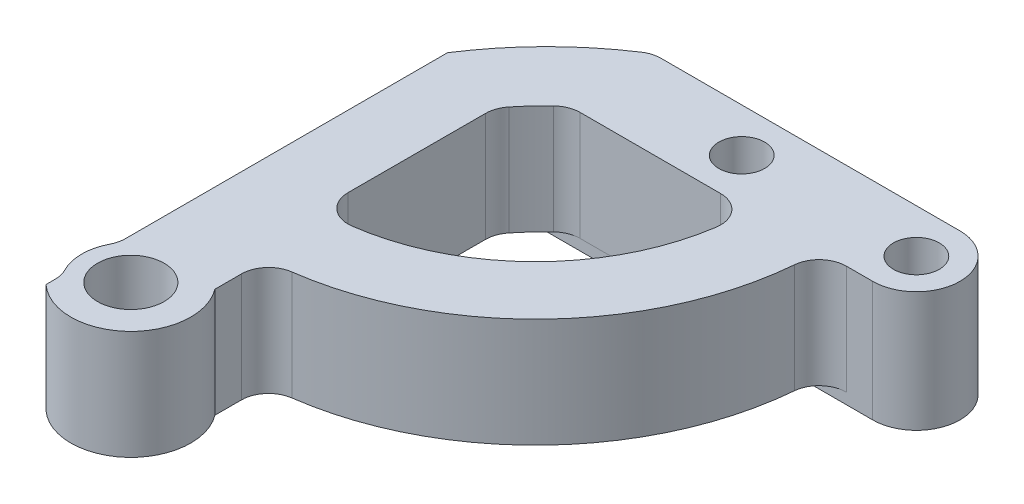
ISO-10303-21;
HEADER;
FILE_DESCRIPTION(('STEP AP214'),'2;1');
FILE_NAME('part.step','',(''),(''),'','','');
FILE_SCHEMA(('AUTOMOTIVE_DESIGN { 1 0 10303 214 1 1 1 1 }'));
ENDSEC;
DATA;
#1=APPLICATION_CONTEXT('core data for automotive mechanical design processes');
#2=APPLICATION_PROTOCOL_DEFINITION('international standard','automotive_design',2000,#1);
#3=PRODUCT_CONTEXT('',#1,'mechanical');
#4=PRODUCT('Part','Part','',(#3));
#5=PRODUCT_RELATED_PRODUCT_CATEGORY('part','',(#4));
#6=PRODUCT_DEFINITION_FORMATION('','',#4);
#7=PRODUCT_DEFINITION_CONTEXT('part definition',#1,'design');
#8=PRODUCT_DEFINITION('design','',#6,#7);
#9=PRODUCT_DEFINITION_SHAPE('','',#8);
#10=(LENGTH_UNIT() NAMED_UNIT(*) SI_UNIT(.MILLI.,.METRE.));
#11=(NAMED_UNIT(*) PLANE_ANGLE_UNIT() SI_UNIT($,.RADIAN.));
#12=(NAMED_UNIT(*) SI_UNIT($,.STERADIAN.) SOLID_ANGLE_UNIT());
#13=UNCERTAINTY_MEASURE_WITH_UNIT(LENGTH_MEASURE(1.E-05),#10,'distance_accuracy_value','');
#14=(GEOMETRIC_REPRESENTATION_CONTEXT(3) GLOBAL_UNCERTAINTY_ASSIGNED_CONTEXT((#13)) GLOBAL_UNIT_ASSIGNED_CONTEXT((#10,
#11,#12)) REPRESENTATION_CONTEXT('',''));
#15=CARTESIAN_POINT('',(0.,0.,0.));
#16=DIRECTION('',(0.,0.,1.));
#17=DIRECTION('',(1.,0.,0.));
#18=AXIS2_PLACEMENT_3D('',#15,#16,#17);
#19=CARTESIAN_POINT('',(-137.900064406004,11.,45.0701479564905));
#20=DIRECTION('',(0.,-1.,0.));
#21=DIRECTION('',(0.,0.,-1.));
#22=AXIS2_PLACEMENT_3D('',#19,#20,#21);
#23=CYLINDRICAL_SURFACE('',#22,5.50000000000002);
#24=CARTESIAN_POINT('',(-137.900064406004,1.,45.0701479564905));
#25=DIRECTION('',(0.,-1.,0.));
#26=DIRECTION('',(0.,0.,-1.));
#27=AXIS2_PLACEMENT_3D('',#24,#25,#26);
#28=CIRCLE('',#27,5.50000000000002);
#29=CARTESIAN_POINT('',(-133.507163129043,1.,41.7607041405488));
#30=VERTEX_POINT('',#29);
#31=CARTESIAN_POINT('',(-141.618040471587,1.,49.1231288318161));
#32=VERTEX_POINT('',#31);
#33=EDGE_CURVE('E330',#30,#32,#28,.T.);
#34=ORIENTED_EDGE('',*,*,#33,.F.);
#35=DIRECTION('',(0.,-1.,0.));
#36=VECTOR('',#35,1.);
#37=CARTESIAN_POINT('',(-133.507163129043,11.,41.7607041405488));
#38=LINE('',#37,#36);
#39=CARTESIAN_POINT('',(-133.507163129043,11.,41.7607041405488));
#40=VERTEX_POINT('',#39);
#41=EDGE_CURVE('E244',#40,#30,#38,.T.);
#42=ORIENTED_EDGE('',*,*,#41,.F.);
#43=CARTESIAN_POINT('',(-137.900064406004,11.,45.0701479564905));
#44=DIRECTION('',(0.,1.,0.));
#45=DIRECTION('',(0.,0.,1.));
#46=AXIS2_PLACEMENT_3D('',#43,#44,#45);
#47=CIRCLE('',#46,5.50000000000002);
#48=CARTESIAN_POINT('',(-141.618040471587,11.,49.1231288318161));
#49=VERTEX_POINT('',#48);
#50=EDGE_CURVE('E222',#49,#40,#47,.T.);
#51=ORIENTED_EDGE('',*,*,#50,.F.);
#52=DIRECTION('',(0.,-1.,0.));
#53=VECTOR('',#52,1.);
#54=CARTESIAN_POINT('',(-141.618040471587,11.,49.1231288318161));
#55=LINE('',#54,#53);
#56=EDGE_CURVE('E232',#49,#32,#55,.T.);
#57=ORIENTED_EDGE('',*,*,#56,.T.);
#58=EDGE_LOOP('',(#34,#42,#51,#57));
#59=FACE_BOUND('',#58,.T.);
#60=ADVANCED_FACE('F33',(#59),#23,.T.);
#61=CARTESIAN_POINT('',(-133.507163129043,11.,41.7607041405488));
#62=DIRECTION('',(-1.,0.,0.));
#63=DIRECTION('',(0.,0.,1.));
#64=AXIS2_PLACEMENT_3D('',#61,#62,#63);
#65=PLANE('',#64);
#66=DIRECTION('',(0.,0.,1.));
#67=VECTOR('',#66,1.);
#68=CARTESIAN_POINT('',(-133.507163129043,1.,41.7607041405488));
#69=LINE('',#68,#67);
#70=CARTESIAN_POINT('',(-133.507163129043,1.,39.3378444562118));
#71=VERTEX_POINT('',#70);
#72=EDGE_CURVE('E342',#71,#30,#69,.T.);
#73=ORIENTED_EDGE('',*,*,#72,.F.);
#74=DIRECTION('',(0.,1.,0.));
#75=VECTOR('',#74,1.);
#76=CARTESIAN_POINT('',(-133.507163129043,11.,39.3378444562118));
#77=LINE('',#76,#75);
#78=CARTESIAN_POINT('',(-133.507163129043,11.,39.3378444562118));
#79=VERTEX_POINT('',#78);
#80=EDGE_CURVE('E281',#71,#79,#77,.T.);
#81=ORIENTED_EDGE('',*,*,#80,.T.);
#82=DIRECTION('',(0.,0.,-1.));
#83=VECTOR('',#82,1.);
#84=CARTESIAN_POINT('',(-133.507163129043,11.,41.7607041405488));
#85=LINE('',#84,#83);
#86=EDGE_CURVE('E226',#40,#79,#85,.T.);
#87=ORIENTED_EDGE('',*,*,#86,.F.);
#88=ORIENTED_EDGE('',*,*,#41,.T.);
#89=EDGE_LOOP('',(#73,#81,#87,#88));
#90=FACE_BOUND('',#89,.T.);
#91=ADVANCED_FACE('F442',(#90),#65,.F.);
#92=CARTESIAN_POINT('',(-134.905127412307,11.,11.0000000667594));
#93=DIRECTION('',(0.,-1.,0.));
#94=DIRECTION('',(0.,0.,-1.));
#95=AXIS2_PLACEMENT_3D('',#92,#93,#94);
#96=CYLINDRICAL_SURFACE('',#95,26.1046770685219);
#97=CARTESIAN_POINT('',(-134.905127412307,1.,11.0000000667594));
#98=DIRECTION('',(0.,-1.,0.));
#99=DIRECTION('',(0.,0.,-1.));
#100=AXIS2_PLACEMENT_3D('',#97,#98,#99);
#101=CIRCLE('',#100,26.1046770685219);
#102=CARTESIAN_POINT('',(-108.900340232312,1.,13.2814926867282));
#103=VERTEX_POINT('',#102);
#104=CARTESIAN_POINT('',(-131.347838560715,1.,36.8611651773679));
#105=VERTEX_POINT('',#104);
#106=EDGE_CURVE('E346',#103,#105,#101,.T.);
#107=ORIENTED_EDGE('',*,*,#106,.F.);
#108=DIRECTION('',(0.,-1.,0.));
#109=VECTOR('',#108,1.);
#110=CARTESIAN_POINT('',(-108.900340232311,11.,13.2814926867282));
#111=LINE('',#110,#109);
#112=CARTESIAN_POINT('',(-108.900340232311,11.,13.2814926867282));
#113=VERTEX_POINT('',#112);
#114=EDGE_CURVE('E259',#103,#113,#111,.F.);
#115=ORIENTED_EDGE('',*,*,#114,.T.);
#116=CARTESIAN_POINT('',(-134.905127412307,11.,11.0000000667594));
#117=DIRECTION('',(0.,1.,0.));
#118=DIRECTION('',(0.,0.,1.));
#119=AXIS2_PLACEMENT_3D('',#116,#117,#118);
#120=CIRCLE('',#119,26.1046770685219);
#121=CARTESIAN_POINT('',(-131.347838560715,11.,36.8611651773679));
#122=VERTEX_POINT('',#121);
#123=EDGE_CURVE('E397',#122,#113,#120,.T.);
#124=ORIENTED_EDGE('',*,*,#123,.F.);
#125=DIRECTION('',(0.,-1.,0.));
#126=VECTOR('',#125,1.);
#127=CARTESIAN_POINT('',(-131.347838560715,11.,36.8611651773679));
#128=LINE('',#127,#126);
#129=EDGE_CURVE('E256',#122,#105,#128,.T.);
#130=ORIENTED_EDGE('',*,*,#129,.T.);
#131=EDGE_LOOP('',(#107,#115,#124,#130));
#132=FACE_BOUND('',#131,.T.);
#133=ADVANCED_FACE('F432',(#132),#96,.T.);
#134=CARTESIAN_POINT('',(-141.618040471587,11.,42.5350633473));
#135=DIRECTION('',(1.,0.,0.));
#136=DIRECTION('',(0.,0.,-1.));
#137=AXIS2_PLACEMENT_3D('',#134,#135,#136);
#138=PLANE('',#137);
#139=DIRECTION('',(0.,0.,-1.));
#140=VECTOR('',#139,1.);
#141=CARTESIAN_POINT('',(-141.618040471587,1.,42.5350633473));
#142=LINE('',#141,#140);
#143=CARTESIAN_POINT('',(-141.618040471587,1.,41.8550626313644));
#144=VERTEX_POINT('',#143);
#145=CARTESIAN_POINT('',(-141.618040471587,1.,12.3375284892954));
#146=VERTEX_POINT('',#145);
#147=EDGE_CURVE('E338',#144,#146,#142,.T.);
#148=ORIENTED_EDGE('',*,*,#147,.F.);
#149=DIRECTION('',(0.,1.,0.));
#150=VECTOR('',#149,1.);
#151=CARTESIAN_POINT('',(-141.618040471587,11.,41.8550626313644));
#152=LINE('',#151,#150);
#153=CARTESIAN_POINT('',(-141.618040471587,11.,41.8550626313644));
#154=VERTEX_POINT('',#153);
#155=EDGE_CURVE('E288',#144,#154,#152,.T.);
#156=ORIENTED_EDGE('',*,*,#155,.T.);
#157=DIRECTION('',(0.,0.,1.));
#158=VECTOR('',#157,1.);
#159=CARTESIAN_POINT('',(-141.618040471587,11.,42.5350633473));
#160=LINE('',#159,#158);
#161=CARTESIAN_POINT('',(-141.618040471587,11.,12.3375284892954));
#162=VERTEX_POINT('',#161);
#163=EDGE_CURVE('E408',#162,#154,#160,.T.);
#164=ORIENTED_EDGE('',*,*,#163,.F.);
#165=DIRECTION('',(0.,-1.,0.));
#166=VECTOR('',#165,1.);
#167=CARTESIAN_POINT('',(-141.618040471587,11.,12.3375284892954));
#168=LINE('',#167,#166);
#169=EDGE_CURVE('E235',#162,#146,#168,.T.);
#170=ORIENTED_EDGE('',*,*,#169,.T.);
#171=EDGE_LOOP('',(#148,#156,#164,#170));
#172=FACE_BOUND('',#171,.T.);
#173=ADVANCED_FACE('F486',(#172),#138,.F.);
#174=CARTESIAN_POINT('',(-137.900064406004,11.,45.0701479564905));
#175=DIRECTION('',(0.,-1.,0.));
#176=DIRECTION('',(0.,0.,-1.));
#177=AXIS2_PLACEMENT_3D('',#174,#175,#176);
#178=CYLINDRICAL_SURFACE('',#177,4.49999999999999);
#179=CARTESIAN_POINT('',(-137.900064406004,1.,45.0701479564905));
#180=DIRECTION('',(0.,-1.,0.));
#181=DIRECTION('',(0.,0.,-1.));
#182=AXIS2_PLACEMENT_3D('',#179,#180,#181);
#183=CIRCLE('',#182,4.49999999999999);
#184=CARTESIAN_POINT('',(-141.897334733879,1.,47.136988522643));
#185=VERTEX_POINT('',#184);
#186=CARTESIAN_POINT('',(-141.897334733879,1.,43.003307390338));
#187=VERTEX_POINT('',#186);
#188=EDGE_CURVE('E325',#185,#187,#183,.T.);
#189=ORIENTED_EDGE('',*,*,#188,.F.);
#190=DIRECTION('',(0.,-1.,0.));
#191=VECTOR('',#190,1.);
#192=CARTESIAN_POINT('',(-141.897334733879,11.,47.136988522643));
#193=LINE('',#192,#191);
#194=CARTESIAN_POINT('',(-141.897334733879,11.,47.136988522643));
#195=VERTEX_POINT('',#194);
#196=EDGE_CURVE('E283',#185,#195,#193,.F.);
#197=ORIENTED_EDGE('',*,*,#196,.T.);
#198=CARTESIAN_POINT('',(-137.900064406004,11.,45.0701479564905));
#199=DIRECTION('',(0.,1.,0.));
#200=DIRECTION('',(0.,0.,1.));
#201=AXIS2_PLACEMENT_3D('',#198,#199,#200);
#202=CIRCLE('',#201,4.49999999999999);
#203=CARTESIAN_POINT('',(-141.897334733879,11.,43.003307390338));
#204=VERTEX_POINT('',#203);
#205=EDGE_CURVE('E315',#204,#195,#202,.T.);
#206=ORIENTED_EDGE('',*,*,#205,.F.);
#207=DIRECTION('',(0.,-1.,0.));
#208=VECTOR('',#207,1.);
#209=CARTESIAN_POINT('',(-141.897334733879,11.,43.003307390338));
#210=LINE('',#209,#208);
#211=EDGE_CURVE('E285',#204,#187,#210,.T.);
#212=ORIENTED_EDGE('',*,*,#211,.T.);
#213=EDGE_LOOP('',(#189,#197,#206,#212));
#214=FACE_BOUND('',#213,.T.);
#215=ADVANCED_FACE('F328',(#214),#178,.T.);
#216=CARTESIAN_POINT('',(-141.618040471587,11.,49.1231288318161));
#217=DIRECTION('',(1.,0.,0.));
#218=DIRECTION('',(0.,0.,-1.));
#219=AXIS2_PLACEMENT_3D('',#216,#217,#218);
#220=PLANE('',#219);
#221=DIRECTION('',(0.,0.,-1.));
#222=VECTOR('',#221,1.);
#223=CARTESIAN_POINT('',(-141.618040471587,1.,49.1231288318161));
#224=LINE('',#223,#222);
#225=CARTESIAN_POINT('',(-141.618040471587,1.,48.2852332816167));
#226=VERTEX_POINT('',#225);
#227=EDGE_CURVE('E55',#32,#226,#224,.T.);
#228=ORIENTED_EDGE('',*,*,#227,.F.);
#229=ORIENTED_EDGE('',*,*,#56,.F.);
#230=DIRECTION('',(0.,0.,1.));
#231=VECTOR('',#230,1.);
#232=CARTESIAN_POINT('',(-141.618040471587,11.,49.1231288318161));
#233=LINE('',#232,#231);
#234=CARTESIAN_POINT('',(-141.618040471587,11.,48.2852332816167));
#235=VERTEX_POINT('',#234);
#236=EDGE_CURVE('E236',#235,#49,#233,.T.);
#237=ORIENTED_EDGE('',*,*,#236,.F.);
#238=DIRECTION('',(0.,1.,0.));
#239=VECTOR('',#238,1.);
#240=CARTESIAN_POINT('',(-141.618040471587,0.,48.2852332816167));
#241=LINE('',#240,#239);
#242=EDGE_CURVE('E290',#235,#226,#241,.F.);
#243=ORIENTED_EDGE('',*,*,#242,.T.);
#244=EDGE_LOOP('',(#228,#229,#237,#243));
#245=FACE_BOUND('',#244,.T.);
#246=ADVANCED_FACE('F320',(#245),#220,.F.);
#247=CARTESIAN_POINT('',(-137.900064406004,11.,45.0701479564905));
#248=DIRECTION('',(0.,-1.,0.));
#249=DIRECTION('',(0.,0.,-1.));
#250=AXIS2_PLACEMENT_3D('',#247,#248,#249);
#251=CYLINDRICAL_SURFACE('',#250,3.04999999999999);
#252=CARTESIAN_POINT('',(-137.900064406004,11.,45.0701479564905));
#253=DIRECTION('',(0.,1.,0.));
#254=DIRECTION('',(0.,0.,1.));
#255=AXIS2_PLACEMENT_3D('',#252,#253,#254);
#256=CIRCLE('',#255,3.04999999999999);
#257=CARTESIAN_POINT('',(-137.900064406004,11.,48.1201479564905));
#258=VERTEX_POINT('',#257);
#259=EDGE_CURVE('E387',#258,#258,#256,.T.);
#260=ORIENTED_EDGE('',*,*,#259,.T.);
#261=EDGE_LOOP('',(#260));
#262=FACE_BOUND('',#261,.T.);
#263=CARTESIAN_POINT('',(-137.900064406004,1.,45.0701479564905));
#264=DIRECTION('',(0.,-1.,0.));
#265=DIRECTION('',(0.,0.,-1.));
#266=AXIS2_PLACEMENT_3D('',#263,#264,#265);
#267=CIRCLE('',#266,3.04999999999999);
#268=CARTESIAN_POINT('',(-137.900064406004,1.,42.0201479564905));
#269=VERTEX_POINT('',#268);
#270=EDGE_CURVE('E215',#269,#269,#267,.T.);
#271=ORIENTED_EDGE('',*,*,#270,.T.);
#272=EDGE_LOOP('',(#271));
#273=FACE_BOUND('',#272,.T.);
#274=ADVANCED_FACE('F518',(#262,#273),#251,.F.);
#275=CARTESIAN_POINT('',(-134.905127412307,11.,11.0000000667594));
#276=DIRECTION('',(0.,-1.,0.));
#277=DIRECTION('',(0.,0.,-1.));
#278=AXIS2_PLACEMENT_3D('',#275,#276,#277);
#279=CYLINDRICAL_SURFACE('',#278,19.6514066306311);
#280=DIRECTION('',(0.,-1.,0.));
#281=VECTOR('',#280,1.);
#282=CARTESIAN_POINT('',(-115.463600053519,11.,13.8644016656835));
#283=LINE('',#282,#281);
#284=CARTESIAN_POINT('',(-115.463600053519,11.,13.8644016656835));
#285=VERTEX_POINT('',#284);
#286=CARTESIAN_POINT('',(-115.463600053519,1.,13.8644016656835));
#287=VERTEX_POINT('',#286);
#288=EDGE_CURVE('E271',#285,#287,#283,.T.);
#289=ORIENTED_EDGE('',*,*,#288,.T.);
#290=CARTESIAN_POINT('',(-134.905127412307,1.,11.0000000667594));
#291=DIRECTION('',(0.,-1.,0.));
#292=DIRECTION('',(0.,0.,-1.));
#293=AXIS2_PLACEMENT_3D('',#290,#291,#292);
#294=CIRCLE('',#293,19.6514066306311);
#295=CARTESIAN_POINT('',(-132.23407891148,1.,30.4690340044935));
#296=VERTEX_POINT('',#295);
#297=EDGE_CURVE('E363',#287,#296,#294,.T.);
#298=ORIENTED_EDGE('',*,*,#297,.T.);
#299=DIRECTION('',(0.,-1.,0.));
#300=VECTOR('',#299,1.);
#301=CARTESIAN_POINT('',(-132.23407891148,11.,30.4690340044935));
#302=LINE('',#301,#300);
#303=CARTESIAN_POINT('',(-132.23407891148,11.,30.4690340044935));
#304=VERTEX_POINT('',#303);
#305=EDGE_CURVE('E274',#296,#304,#302,.F.);
#306=ORIENTED_EDGE('',*,*,#305,.T.);
#307=CARTESIAN_POINT('',(-134.905127412307,11.,11.0000000667594));
#308=DIRECTION('',(0.,1.,0.));
#309=DIRECTION('',(0.,0.,1.));
#310=AXIS2_PLACEMENT_3D('',#307,#308,#309);
#311=CIRCLE('',#310,19.6514066306311);
#312=EDGE_CURVE('E373',#304,#285,#311,.T.);
#313=ORIENTED_EDGE('',*,*,#312,.T.);
#314=EDGE_LOOP('',(#289,#298,#306,#313));
#315=FACE_BOUND('',#314,.T.);
#316=ADVANCED_FACE('F522',(#315),#279,.F.);
#317=CARTESIAN_POINT('',(-115.253720781676,11.,11.0000000667594));
#318=DIRECTION('',(0.,0.,1.));
#319=DIRECTION('',(1.,0.,0.));
#320=AXIS2_PLACEMENT_3D('',#317,#318,#319);
#321=PLANE('',#320);
#322=DIRECTION('',(0.,1.,0.));
#323=VECTOR('',#322,1.);
#324=CARTESIAN_POINT('',(-130.807896641582,0.,11.0000000667594));
#325=LINE('',#324,#323);
#326=CARTESIAN_POINT('',(-130.807896641582,11.,11.0000000667594));
#327=VERTEX_POINT('',#326);
#328=CARTESIAN_POINT('',(-130.807896641582,1.,11.0000000667594));
#329=VERTEX_POINT('',#328);
#330=EDGE_CURVE('E276',#327,#329,#325,.F.);
#331=ORIENTED_EDGE('',*,*,#330,.T.);
#332=DIRECTION('',(1.,0.,0.));
#333=VECTOR('',#332,1.);
#334=CARTESIAN_POINT('',(-115.253720781676,1.,11.0000000667594));
#335=LINE('',#334,#333);
#336=CARTESIAN_POINT('',(-117.936899767403,1.,11.0000000667594));
#337=VERTEX_POINT('',#336);
#338=EDGE_CURVE('E48',#329,#337,#335,.T.);
#339=ORIENTED_EDGE('',*,*,#338,.T.);
#340=DIRECTION('',(0.,1.,0.));
#341=VECTOR('',#340,1.);
#342=CARTESIAN_POINT('',(-117.936899767403,11.,11.0000000667594));
#343=LINE('',#342,#341);
#344=CARTESIAN_POINT('',(-117.936899767403,11.,11.0000000667594));
#345=VERTEX_POINT('',#344);
#346=EDGE_CURVE('E279',#337,#345,#343,.T.);
#347=ORIENTED_EDGE('',*,*,#346,.T.);
#348=DIRECTION('',(-1.,0.,0.));
#349=VECTOR('',#348,1.);
#350=CARTESIAN_POINT('',(-115.253720781676,11.,11.0000000667594));
#351=LINE('',#350,#349);
#352=EDGE_CURVE('E378',#345,#327,#351,.T.);
#353=ORIENTED_EDGE('',*,*,#352,.T.);
#354=EDGE_LOOP('',(#331,#339,#347,#353));
#355=FACE_BOUND('',#354,.T.);
#356=ADVANCED_FACE('F528',(#355),#321,.T.);
#357=CARTESIAN_POINT('',(-115.936153865527,11.,28.934107444418));
#358=DIRECTION('',(0.,-1.,0.));
#359=DIRECTION('',(0.,0.,-1.));
#360=AXIS2_PLACEMENT_3D('',#357,#358,#359);
#361=CYLINDRICAL_SURFACE('',#360,23.9331613100406);
#362=DIRECTION('',(0.,-1.,0.));
#363=VECTOR('',#362,1.);
#364=CARTESIAN_POINT('',(-134.499387278877,11.,13.8277321169641));
#365=LINE('',#364,#363);
#366=CARTESIAN_POINT('',(-134.499387278877,11.,13.8277321169641));
#367=VERTEX_POINT('',#366);
#368=CARTESIAN_POINT('',(-134.499387278877,1.,13.8277321169641));
#369=VERTEX_POINT('',#368);
#370=EDGE_CURVE('E263',#367,#369,#365,.T.);
#371=ORIENTED_EDGE('',*,*,#370,.T.);
#372=CARTESIAN_POINT('',(-115.936153865527,1.,28.934107444418));
#373=DIRECTION('',(0.,-1.,0.));
#374=DIRECTION('',(0.,0.,-1.));
#375=AXIS2_PLACEMENT_3D('',#372,#373,#374);
#376=CIRCLE('',#375,23.9331613100406);
#377=CARTESIAN_POINT('',(-132.542561743118,1.,11.6997398118211));
#378=VERTEX_POINT('',#377);
#379=EDGE_CURVE('E352',#369,#378,#376,.T.);
#380=ORIENTED_EDGE('',*,*,#379,.T.);
#381=DIRECTION('',(0.,-1.,0.));
#382=VECTOR('',#381,1.);
#383=CARTESIAN_POINT('',(-132.542561743118,11.,11.6997398118211));
#384=LINE('',#383,#382);
#385=CARTESIAN_POINT('',(-132.542561743118,11.,11.6997398118211));
#386=VERTEX_POINT('',#385);
#387=EDGE_CURVE('E261',#378,#386,#384,.F.);
#388=ORIENTED_EDGE('',*,*,#387,.T.);
#389=CARTESIAN_POINT('',(-115.936153865527,11.,28.934107444418));
#390=DIRECTION('',(0.,1.,0.));
#391=DIRECTION('',(0.,0.,1.));
#392=AXIS2_PLACEMENT_3D('',#389,#390,#391);
#393=CIRCLE('',#392,23.9331613100406);
#394=EDGE_CURVE('E381',#386,#367,#393,.T.);
#395=ORIENTED_EDGE('',*,*,#394,.T.);
#396=EDGE_LOOP('',(#371,#380,#388,#395));
#397=FACE_BOUND('',#396,.T.);
#398=ADVANCED_FACE('F553',(#397),#361,.F.);
#399=CARTESIAN_POINT('',(-135.059388775707,11.,14.5432041766409));
#400=DIRECTION('',(0.999999419177983,0.,0.00107779575862326));
#401=DIRECTION('',(0.00107779575862326,0.,-0.999999419177983));
#402=AXIS2_PLACEMENT_3D('',#399,#400,#401);
#403=PLANE('',#402);
#404=DIRECTION('',(0.,1.,0.));
#405=VECTOR('',#404,1.);
#406=CARTESIAN_POINT('',(-135.073881188368,0.,27.9895404869568));
#407=LINE('',#406,#405);
#408=CARTESIAN_POINT('',(-135.073881188368,11.,27.9895404869568));
#409=VERTEX_POINT('',#408);
#410=CARTESIAN_POINT('',(-135.073881188368,1.,27.9895404869568));
#411=VERTEX_POINT('',#410);
#412=EDGE_CURVE('E266',#409,#411,#407,.F.);
#413=ORIENTED_EDGE('',*,*,#412,.T.);
#414=DIRECTION('',(0.00107779575862326,0.,-0.999999419177983));
#415=VECTOR('',#414,1.);
#416=CARTESIAN_POINT('',(-135.059388775707,1.,14.5432041766409));
#417=LINE('',#416,#415);
#418=CARTESIAN_POINT('',(-135.060315474511,1.,15.4030129660278));
#419=VERTEX_POINT('',#418);
#420=EDGE_CURVE('E360',#411,#419,#417,.T.);
#421=ORIENTED_EDGE('',*,*,#420,.T.);
#422=DIRECTION('',(0.,1.,0.));
#423=VECTOR('',#422,1.);
#424=CARTESIAN_POINT('',(-135.060315474511,11.,15.4030129660278));
#425=LINE('',#424,#423);
#426=CARTESIAN_POINT('',(-135.060315474511,11.,15.4030129660278));
#427=VERTEX_POINT('',#426);
#428=EDGE_CURVE('E269',#419,#427,#425,.T.);
#429=ORIENTED_EDGE('',*,*,#428,.T.);
#430=DIRECTION('',(-0.00107779575862326,0.,0.999999419177983));
#431=VECTOR('',#430,1.);
#432=CARTESIAN_POINT('',(-135.059388775707,11.,14.5432041766409));
#433=LINE('',#432,#431);
#434=EDGE_CURVE('E384',#427,#409,#433,.T.);
#435=ORIENTED_EDGE('',*,*,#434,.T.);
#436=EDGE_LOOP('',(#413,#421,#429,#435));
#437=FACE_BOUND('',#436,.T.);
#438=ADVANCED_FACE('F459',(#437),#403,.T.);
#439=CARTESIAN_POINT('',(-106.409906515038,11.,13.499987308782));
#440=DIRECTION('',(0.,-1.,0.));
#441=DIRECTION('',(0.,0.,-1.));
#442=AXIS2_PLACEMENT_3D('',#439,#440,#441);
#443=CYLINDRICAL_SURFACE('',#442,2.5);
#444=CARTESIAN_POINT('',(-106.409906515038,1.,13.499987308782));
#445=DIRECTION('',(0.,-1.,0.));
#446=DIRECTION('',(0.,0.,-1.));
#447=AXIS2_PLACEMENT_3D('',#444,#445,#446);
#448=CIRCLE('',#447,2.5);
#449=CARTESIAN_POINT('',(-106.409906515038,1.,10.999987308782));
#450=VERTEX_POINT('',#449);
#451=EDGE_CURVE('E348',#450,#103,#448,.F.);
#452=ORIENTED_EDGE('',*,*,#451,.F.);
#453=DIRECTION('',(0.,1.,0.));
#454=VECTOR('',#453,1.);
#455=CARTESIAN_POINT('',(-106.409906515038,0.,10.999987308782));
#456=LINE('',#455,#454);
#457=CARTESIAN_POINT('',(-106.409906515038,11.,10.999987308782));
#458=VERTEX_POINT('',#457);
#459=EDGE_CURVE('E254',#458,#450,#456,.F.);
#460=ORIENTED_EDGE('',*,*,#459,.F.);
#461=CARTESIAN_POINT('',(-106.409906515038,11.,13.499987308782));
#462=DIRECTION('',(0.,1.,0.));
#463=DIRECTION('',(0.,0.,1.));
#464=AXIS2_PLACEMENT_3D('',#461,#462,#463);
#465=CIRCLE('',#464,2.5);
#466=EDGE_CURVE('E293',#113,#458,#465,.F.);
#467=ORIENTED_EDGE('',*,*,#466,.F.);
#468=ORIENTED_EDGE('',*,*,#114,.F.);
#469=EDGE_LOOP('',(#452,#460,#467,#468));
#470=FACE_BOUND('',#469,.T.);
#471=ADVANCED_FACE('F427',(#470),#443,.F.);
#472=CARTESIAN_POINT('',(-132.560316926566,11.,15.4057074554244));
#473=DIRECTION('',(0.,-1.,0.));
#474=DIRECTION('',(0.,0.,-1.));
#475=AXIS2_PLACEMENT_3D('',#472,#473,#474);
#476=CYLINDRICAL_SURFACE('',#475,2.5);
#477=CARTESIAN_POINT('',(-132.560316926566,1.,15.4057074554244));
#478=DIRECTION('',(0.,-1.,0.));
#479=DIRECTION('',(0.,0.,-1.));
#480=AXIS2_PLACEMENT_3D('',#477,#478,#479);
#481=CIRCLE('',#480,2.5);
#482=EDGE_CURVE('E358',#369,#419,#481,.F.);
#483=ORIENTED_EDGE('',*,*,#482,.F.);
#484=ORIENTED_EDGE('',*,*,#370,.F.);
#485=CARTESIAN_POINT('',(-132.560316926566,11.,15.4057074554244));
#486=DIRECTION('',(0.,1.,0.));
#487=DIRECTION('',(0.,0.,1.));
#488=AXIS2_PLACEMENT_3D('',#485,#486,#487);
#489=CIRCLE('',#488,2.5);
#490=EDGE_CURVE('E295',#427,#367,#489,.F.);
#491=ORIENTED_EDGE('',*,*,#490,.F.);
#492=ORIENTED_EDGE('',*,*,#428,.F.);
#493=EDGE_LOOP('',(#483,#484,#491,#492));
#494=FACE_BOUND('',#493,.T.);
#495=ADVANCED_FACE('F458',(#494),#476,.F.);
#496=CARTESIAN_POINT('',(-132.573882640423,11.,27.9922349763533));
#497=DIRECTION('',(0.,-1.,0.));
#498=DIRECTION('',(0.,0.,-1.));
#499=AXIS2_PLACEMENT_3D('',#496,#497,#498);
#500=CYLINDRICAL_SURFACE('',#499,2.5);
#501=CARTESIAN_POINT('',(-132.573882640423,1.,27.9922349763533));
#502=DIRECTION('',(0.,-1.,0.));
#503=DIRECTION('',(0.,0.,-1.));
#504=AXIS2_PLACEMENT_3D('',#501,#502,#503);
#505=CIRCLE('',#504,2.5);
#506=EDGE_CURVE('E366',#411,#296,#505,.F.);
#507=ORIENTED_EDGE('',*,*,#506,.F.);
#508=ORIENTED_EDGE('',*,*,#412,.F.);
#509=CARTESIAN_POINT('',(-132.573882640423,11.,27.9922349763533));
#510=DIRECTION('',(0.,1.,0.));
#511=DIRECTION('',(0.,0.,1.));
#512=AXIS2_PLACEMENT_3D('',#509,#510,#511);
#513=CIRCLE('',#512,2.5);
#514=EDGE_CURVE('E297',#304,#409,#513,.F.);
#515=ORIENTED_EDGE('',*,*,#514,.F.);
#516=ORIENTED_EDGE('',*,*,#305,.F.);
#517=EDGE_LOOP('',(#507,#508,#515,#516));
#518=FACE_BOUND('',#517,.T.);
#519=ADVANCED_FACE('F462',(#518),#500,.F.);
#520=CARTESIAN_POINT('',(-117.936899767403,11.,13.5000000667594));
#521=DIRECTION('',(0.,-1.,0.));
#522=DIRECTION('',(0.,0.,-1.));
#523=AXIS2_PLACEMENT_3D('',#520,#521,#522);
#524=CYLINDRICAL_SURFACE('',#523,2.5);
#525=CARTESIAN_POINT('',(-117.936899767403,1.,13.5000000667594));
#526=DIRECTION('',(0.,-1.,0.));
#527=DIRECTION('',(0.,0.,-1.));
#528=AXIS2_PLACEMENT_3D('',#525,#526,#527);
#529=CIRCLE('',#528,2.5);
#530=EDGE_CURVE('E356',#287,#337,#529,.F.);
#531=ORIENTED_EDGE('',*,*,#530,.F.);
#532=ORIENTED_EDGE('',*,*,#288,.F.);
#533=CARTESIAN_POINT('',(-117.936899767403,11.,13.5000000667594));
#534=DIRECTION('',(0.,1.,0.));
#535=DIRECTION('',(0.,0.,1.));
#536=AXIS2_PLACEMENT_3D('',#533,#534,#535);
#537=CIRCLE('',#536,2.5);
#538=EDGE_CURVE('E299',#345,#285,#537,.F.);
#539=ORIENTED_EDGE('',*,*,#538,.F.);
#540=ORIENTED_EDGE('',*,*,#346,.F.);
#541=EDGE_LOOP('',(#531,#532,#539,#540));
#542=FACE_BOUND('',#541,.T.);
#543=ADVANCED_FACE('F466',(#542),#524,.F.);
#544=CARTESIAN_POINT('',(-130.807896641582,11.,13.5000000667594));
#545=DIRECTION('',(0.,-1.,0.));
#546=DIRECTION('',(0.,0.,-1.));
#547=AXIS2_PLACEMENT_3D('',#544,#545,#546);
#548=CYLINDRICAL_SURFACE('',#547,2.5);
#549=CARTESIAN_POINT('',(-130.807896641582,1.,13.5000000667594));
#550=DIRECTION('',(0.,-1.,0.));
#551=DIRECTION('',(0.,0.,-1.));
#552=AXIS2_PLACEMENT_3D('',#549,#550,#551);
#553=CIRCLE('',#552,2.5);
#554=EDGE_CURVE('E350',#329,#378,#553,.F.);
#555=ORIENTED_EDGE('',*,*,#554,.F.);
#556=ORIENTED_EDGE('',*,*,#330,.F.);
#557=CARTESIAN_POINT('',(-130.807896641582,11.,13.5000000667594));
#558=DIRECTION('',(0.,1.,0.));
#559=DIRECTION('',(0.,0.,1.));
#560=AXIS2_PLACEMENT_3D('',#557,#558,#559);
#561=CIRCLE('',#560,2.5);
#562=EDGE_CURVE('E301',#386,#327,#561,.F.);
#563=ORIENTED_EDGE('',*,*,#562,.F.);
#564=ORIENTED_EDGE('',*,*,#387,.F.);
#565=EDGE_LOOP('',(#555,#556,#563,#564));
#566=FACE_BOUND('',#565,.T.);
#567=ADVANCED_FACE('F470',(#566),#548,.F.);
#568=CARTESIAN_POINT('',(-131.007163129043,11.,39.3378444562118));
#569=DIRECTION('',(0.,-1.,0.));
#570=DIRECTION('',(0.,0.,-1.));
#571=AXIS2_PLACEMENT_3D('',#568,#569,#570);
#572=CYLINDRICAL_SURFACE('',#571,2.5);
#573=CARTESIAN_POINT('',(-131.007163129043,1.,39.3378444562118));
#574=DIRECTION('',(0.,-1.,0.));
#575=DIRECTION('',(0.,0.,-1.));
#576=AXIS2_PLACEMENT_3D('',#573,#574,#575);
#577=CIRCLE('',#576,2.5);
#578=EDGE_CURVE('E344',#105,#71,#577,.F.);
#579=ORIENTED_EDGE('',*,*,#578,.F.);
#580=ORIENTED_EDGE('',*,*,#129,.F.);
#581=CARTESIAN_POINT('',(-131.007163129043,11.,39.3378444562118));
#582=DIRECTION('',(0.,1.,0.));
#583=DIRECTION('',(0.,0.,1.));
#584=AXIS2_PLACEMENT_3D('',#581,#582,#583);
#585=CIRCLE('',#584,2.5);
#586=EDGE_CURVE('E303',#79,#122,#585,.F.);
#587=ORIENTED_EDGE('',*,*,#586,.F.);
#588=ORIENTED_EDGE('',*,*,#80,.F.);
#589=EDGE_LOOP('',(#579,#580,#587,#588));
#590=FACE_BOUND('',#589,.T.);
#591=ADVANCED_FACE('F437',(#590),#572,.F.);
#592=CARTESIAN_POINT('',(-144.118040471587,11.,41.8550626313644));
#593=DIRECTION('',(0.,-1.,0.));
#594=DIRECTION('',(0.,0.,-1.));
#595=AXIS2_PLACEMENT_3D('',#592,#593,#594);
#596=CYLINDRICAL_SURFACE('',#595,2.5);
#597=CARTESIAN_POINT('',(-144.118040471587,1.,41.8550626313644));
#598=DIRECTION('',(0.,-1.,0.));
#599=DIRECTION('',(0.,0.,-1.));
#600=AXIS2_PLACEMENT_3D('',#597,#598,#599);
#601=CIRCLE('',#600,2.5);
#602=EDGE_CURVE('E332',#187,#144,#601,.F.);
#603=ORIENTED_EDGE('',*,*,#602,.F.);
#604=ORIENTED_EDGE('',*,*,#211,.F.);
#605=CARTESIAN_POINT('',(-144.118040471587,11.,41.8550626313644));
#606=DIRECTION('',(0.,1.,0.));
#607=DIRECTION('',(0.,0.,1.));
#608=AXIS2_PLACEMENT_3D('',#605,#606,#607);
#609=CIRCLE('',#608,2.5);
#610=EDGE_CURVE('E305',#154,#204,#609,.F.);
#611=ORIENTED_EDGE('',*,*,#610,.F.);
#612=ORIENTED_EDGE('',*,*,#155,.F.);
#613=EDGE_LOOP('',(#603,#604,#611,#612));
#614=FACE_BOUND('',#613,.T.);
#615=ADVANCED_FACE('F476',(#614),#596,.F.);
#616=CARTESIAN_POINT('',(-144.118040471587,11.,48.2852332816167));
#617=DIRECTION('',(0.,-1.,0.));
#618=DIRECTION('',(0.,0.,-1.));
#619=AXIS2_PLACEMENT_3D('',#616,#617,#618);
#620=CYLINDRICAL_SURFACE('',#619,2.5);
#621=CARTESIAN_POINT('',(-144.118040471587,1.,48.2852332816167));
#622=DIRECTION('',(0.,-1.,0.));
#623=DIRECTION('',(0.,0.,-1.));
#624=AXIS2_PLACEMENT_3D('',#621,#622,#623);
#625=CIRCLE('',#624,2.5);
#626=EDGE_CURVE('E11',#226,#185,#625,.F.);
#627=ORIENTED_EDGE('',*,*,#626,.F.);
#628=ORIENTED_EDGE('',*,*,#242,.F.);
#629=CARTESIAN_POINT('',(-144.118040471587,11.,48.2852332816167));
#630=DIRECTION('',(0.,1.,0.));
#631=DIRECTION('',(0.,0.,1.));
#632=AXIS2_PLACEMENT_3D('',#629,#630,#631);
#633=CIRCLE('',#632,2.5);
#634=EDGE_CURVE('E41',#195,#235,#633,.F.);
#635=ORIENTED_EDGE('',*,*,#634,.F.);
#636=ORIENTED_EDGE('',*,*,#196,.F.);
#637=EDGE_LOOP('',(#627,#628,#635,#636));
#638=FACE_BOUND('',#637,.T.);
#639=ADVANCED_FACE('F35',(#638),#620,.F.);
#640=CARTESIAN_POINT('',(-137.900064406004,11.,45.0701479564905));
#641=DIRECTION('',(0.,1.,0.));
#642=DIRECTION('',(0.,0.,1.));
#643=AXIS2_PLACEMENT_3D('',#640,#641,#642);
#644=PLANE('',#643);
#645=ORIENTED_EDGE('',*,*,#352,.F.);
#646=ORIENTED_EDGE('',*,*,#538,.T.);
#647=ORIENTED_EDGE('',*,*,#312,.F.);
#648=ORIENTED_EDGE('',*,*,#514,.T.);
#649=ORIENTED_EDGE('',*,*,#434,.F.);
#650=ORIENTED_EDGE('',*,*,#490,.T.);
#651=ORIENTED_EDGE('',*,*,#394,.F.);
#652=ORIENTED_EDGE('',*,*,#562,.T.);
#653=EDGE_LOOP('',(#645,#646,#647,#648,#649,#650,#651,#652));
#654=FACE_BOUND('',#653,.T.);
#655=ORIENTED_EDGE('',*,*,#259,.F.);
#656=EDGE_LOOP('',(#655));
#657=FACE_BOUND('',#656,.T.);
#658=DIRECTION('',(-1.,0.,0.));
#659=VECTOR('',#658,1.);
#660=CARTESIAN_POINT('',(-104.000008179268,11.,2.99998730878197));
#661=LINE('',#660,#659);
#662=CARTESIAN_POINT('',(-104.000008179268,11.,2.99998730878197));
#663=VERTEX_POINT('',#662);
#664=CARTESIAN_POINT('',(-131.402518303239,11.,2.99998730878198));
#665=VERTEX_POINT('',#664);
#666=EDGE_CURVE('E404',#663,#665,#661,.T.);
#667=ORIENTED_EDGE('',*,*,#666,.T.);
#668=CARTESIAN_POINT('',(-131.402518303239,11.,5.49998730878198));
#669=DIRECTION('',(0.,1.,0.));
#670=DIRECTION('',(0.,0.,1.));
#671=AXIS2_PLACEMENT_3D('',#668,#669,#670);
#672=CIRCLE('',#671,2.5);
#673=CARTESIAN_POINT('',(-132.779614219905,11.,3.413457453663));
#674=VERTEX_POINT('',#673);
#675=EDGE_CURVE('E252',#665,#674,#672,.T.);
#676=ORIENTED_EDGE('',*,*,#675,.T.);
#677=CARTESIAN_POINT('',(-115.936153865527,11.,28.934107444418));
#678=DIRECTION('',(0.,1.,0.));
#679=DIRECTION('',(0.,0.,1.));
#680=AXIS2_PLACEMENT_3D('',#677,#678,#679);
#681=CIRCLE('',#680,30.5778634417141);
#682=EDGE_CURVE('E406',#674,#162,#681,.T.);
#683=ORIENTED_EDGE('',*,*,#682,.T.);
#684=ORIENTED_EDGE('',*,*,#163,.T.);
#685=ORIENTED_EDGE('',*,*,#610,.T.);
#686=ORIENTED_EDGE('',*,*,#205,.T.);
#687=ORIENTED_EDGE('',*,*,#634,.T.);
#688=ORIENTED_EDGE('',*,*,#236,.T.);
#689=ORIENTED_EDGE('',*,*,#50,.T.);
#690=ORIENTED_EDGE('',*,*,#86,.T.);
#691=ORIENTED_EDGE('',*,*,#586,.T.);
#692=ORIENTED_EDGE('',*,*,#123,.T.);
#693=ORIENTED_EDGE('',*,*,#466,.T.);
#694=DIRECTION('',(1.,0.,0.));
#695=VECTOR('',#694,1.);
#696=CARTESIAN_POINT('',(-104.000008179268,11.,10.999987308782));
#697=LINE('',#696,#695);
#698=CARTESIAN_POINT('',(-104.000008179268,11.,10.999987308782));
#699=VERTEX_POINT('',#698);
#700=EDGE_CURVE('E400',#458,#699,#697,.T.);
#701=ORIENTED_EDGE('',*,*,#700,.T.);
#702=CARTESIAN_POINT('',(-104.000008179268,11.,6.99998730878198));
#703=DIRECTION('',(0.,1.,0.));
#704=DIRECTION('',(0.,0.,1.));
#705=AXIS2_PLACEMENT_3D('',#702,#703,#704);
#706=CIRCLE('',#705,4.);
#707=EDGE_CURVE('E402',#699,#663,#706,.T.);
#708=ORIENTED_EDGE('',*,*,#707,.T.);
#709=EDGE_LOOP('',(#667,#676,#683,#684,#685,#686,#687,#688,#689,#690,#691,#692,#693,#701,#708));
#710=FACE_BOUND('',#709,.T.);
#711=CARTESIAN_POINT('',(-120.,11.,7.));
#712=DIRECTION('',(0.,1.,0.));
#713=DIRECTION('',(0.,0.,1.));
#714=AXIS2_PLACEMENT_3D('',#711,#712,#713);
#715=CIRCLE('',#714,2.1);
#716=CARTESIAN_POINT('',(-120.,11.,9.1));
#717=VERTEX_POINT('',#716);
#718=EDGE_CURVE('E204',#717,#717,#715,.T.);
#719=ORIENTED_EDGE('',*,*,#718,.F.);
#720=EDGE_LOOP('',(#719));
#721=FACE_BOUND('',#720,.T.);
#722=CARTESIAN_POINT('',(-104.000008179268,11.,6.99998730878198));
#723=DIRECTION('',(0.,1.,0.));
#724=DIRECTION('',(0.,0.,1.));
#725=AXIS2_PLACEMENT_3D('',#722,#723,#724);
#726=CIRCLE('',#725,2.1);
#727=CARTESIAN_POINT('',(-104.000008179268,11.,9.09998730878198));
#728=VERTEX_POINT('',#727);
#729=EDGE_CURVE('E370',#728,#728,#726,.T.);
#730=ORIENTED_EDGE('',*,*,#729,.F.);
#731=EDGE_LOOP('',(#730));
#732=FACE_BOUND('',#731,.T.);
#733=ADVANCED_FACE('F311',(#654,#657,#710,#721,#732),#644,.T.);
#734=CARTESIAN_POINT('',(-137.900064406004,0.,45.0701479564905));
#735=DIRECTION('',(0.,1.,0.));
#736=DIRECTION('',(0.,0.,1.));
#737=AXIS2_PLACEMENT_3D('',#734,#735,#736);
#738=PLANE('',#737);
#739=CARTESIAN_POINT('',(-120.,0.,7.));
#740=DIRECTION('',(0.,1.,0.));
#741=DIRECTION('',(0.,0.,1.));
#742=AXIS2_PLACEMENT_3D('',#739,#740,#741);
#743=CIRCLE('',#742,2.1);
#744=CARTESIAN_POINT('',(-120.,0.,9.1));
#745=VERTEX_POINT('',#744);
#746=EDGE_CURVE('E390',#745,#745,#743,.T.);
#747=ORIENTED_EDGE('',*,*,#746,.T.);
#748=EDGE_LOOP('',(#747));
#749=FACE_BOUND('',#748,.T.);
#750=DIRECTION('',(1.,0.,0.));
#751=VECTOR('',#750,1.);
#752=CARTESIAN_POINT('',(-104.000008179268,0.,10.999987308782));
#753=LINE('',#752,#751);
#754=CARTESIAN_POINT('',(-140.702523555506,0.,10.999987308782));
#755=VERTEX_POINT('',#754);
#756=CARTESIAN_POINT('',(-104.000008179268,0.,10.999987308782));
#757=VERTEX_POINT('',#756);
#758=EDGE_CURVE('E194',#755,#757,#753,.T.);
#759=ORIENTED_EDGE('',*,*,#758,.F.);
#760=CARTESIAN_POINT('',(-115.936153865527,0.,28.934107444418));
#761=DIRECTION('',(0.,1.,0.));
#762=DIRECTION('',(0.,0.,1.));
#763=AXIS2_PLACEMENT_3D('',#760,#761,#762);
#764=CIRCLE('',#763,30.5778634417141);
#765=CARTESIAN_POINT('',(-132.779614219905,0.,3.413457453663));
#766=VERTEX_POINT('',#765);
#767=EDGE_CURVE('E199',#766,#755,#764,.T.);
#768=ORIENTED_EDGE('',*,*,#767,.F.);
#769=CARTESIAN_POINT('',(-131.402518303239,0.,5.49998730878198));
#770=DIRECTION('',(0.,1.,0.));
#771=DIRECTION('',(0.,0.,1.));
#772=AXIS2_PLACEMENT_3D('',#769,#770,#771);
#773=CIRCLE('',#772,2.5);
#774=CARTESIAN_POINT('',(-131.402518303239,0.,2.99998730878198));
#775=VERTEX_POINT('',#774);
#776=EDGE_CURVE('E248',#766,#775,#773,.F.);
#777=ORIENTED_EDGE('',*,*,#776,.T.);
#778=DIRECTION('',(-1.,0.,0.));
#779=VECTOR('',#778,1.);
#780=CARTESIAN_POINT('',(-104.000008179268,0.,2.99998730878197));
#781=LINE('',#780,#779);
#782=CARTESIAN_POINT('',(-104.000008179268,0.,2.99998730878197));
#783=VERTEX_POINT('',#782);
#784=EDGE_CURVE('E223',#783,#775,#781,.T.);
#785=ORIENTED_EDGE('',*,*,#784,.F.);
#786=CARTESIAN_POINT('',(-104.000008179268,0.,6.99998730878198));
#787=DIRECTION('',(0.,1.,0.));
#788=DIRECTION('',(0.,0.,1.));
#789=AXIS2_PLACEMENT_3D('',#786,#787,#788);
#790=CIRCLE('',#789,4.);
#791=EDGE_CURVE('E201',#757,#783,#790,.T.);
#792=ORIENTED_EDGE('',*,*,#791,.F.);
#793=EDGE_LOOP('',(#759,#768,#777,#785,#792));
#794=FACE_BOUND('',#793,.T.);
#795=CARTESIAN_POINT('',(-104.000008179268,0.,6.99998730878198));
#796=DIRECTION('',(0.,1.,0.));
#797=DIRECTION('',(0.,0.,1.));
#798=AXIS2_PLACEMENT_3D('',#795,#796,#797);
#799=CIRCLE('',#798,2.1);
#800=CARTESIAN_POINT('',(-104.000008179268,0.,9.09998730878198));
#801=VERTEX_POINT('',#800);
#802=EDGE_CURVE('E214',#801,#801,#799,.T.);
#803=ORIENTED_EDGE('',*,*,#802,.T.);
#804=EDGE_LOOP('',(#803));
#805=FACE_BOUND('',#804,.T.);
#806=ADVANCED_FACE('F196',(#749,#794,#805),#738,.F.);
#807=CARTESIAN_POINT('',(-104.000008179268,11.,10.999987308782));
#808=DIRECTION('',(0.,0.,-1.));
#809=DIRECTION('',(-1.,0.,0.));
#810=AXIS2_PLACEMENT_3D('',#807,#808,#809);
#811=PLANE('',#810);
#812=ORIENTED_EDGE('',*,*,#758,.T.);
#813=DIRECTION('',(0.,-1.,0.));
#814=VECTOR('',#813,1.);
#815=CARTESIAN_POINT('',(-104.000008179268,11.,10.999987308782));
#816=LINE('',#815,#814);
#817=EDGE_CURVE('E242',#699,#757,#816,.T.);
#818=ORIENTED_EDGE('',*,*,#817,.F.);
#819=ORIENTED_EDGE('',*,*,#700,.F.);
#820=ORIENTED_EDGE('',*,*,#459,.T.);
#821=DIRECTION('',(1.,0.,0.));
#822=VECTOR('',#821,1.);
#823=CARTESIAN_POINT('',(-151.581641097806,1.,10.999987308782));
#824=LINE('',#823,#822);
#825=CARTESIAN_POINT('',(-140.702523555506,1.,10.999987308782));
#826=VERTEX_POINT('',#825);
#827=EDGE_CURVE('E211',#826,#450,#824,.T.);
#828=ORIENTED_EDGE('',*,*,#827,.F.);
#829=DIRECTION('',(0.,-1.,0.));
#830=VECTOR('',#829,1.);
#831=CARTESIAN_POINT('',(-140.702523555506,11.,10.999987308782));
#832=LINE('',#831,#830);
#833=EDGE_CURVE('E208',#755,#826,#832,.F.);
#834=ORIENTED_EDGE('',*,*,#833,.F.);
#835=EDGE_LOOP('',(#812,#818,#819,#820,#828,#834));
#836=FACE_BOUND('',#835,.T.);
#837=ADVANCED_FACE('F209',(#836),#811,.F.);
#838=CARTESIAN_POINT('',(-104.000008179268,11.,6.99998730878198));
#839=DIRECTION('',(0.,-1.,0.));
#840=DIRECTION('',(0.,0.,-1.));
#841=AXIS2_PLACEMENT_3D('',#838,#839,#840);
#842=CYLINDRICAL_SURFACE('',#841,4.);
#843=ORIENTED_EDGE('',*,*,#791,.T.);
#844=DIRECTION('',(0.,-1.,0.));
#845=VECTOR('',#844,1.);
#846=CARTESIAN_POINT('',(-104.000008179268,11.,2.99998730878197));
#847=LINE('',#846,#845);
#848=EDGE_CURVE('E239',#663,#783,#847,.T.);
#849=ORIENTED_EDGE('',*,*,#848,.F.);
#850=ORIENTED_EDGE('',*,*,#707,.F.);
#851=ORIENTED_EDGE('',*,*,#817,.T.);
#852=EDGE_LOOP('',(#843,#849,#850,#851));
#853=FACE_BOUND('',#852,.T.);
#854=ADVANCED_FACE('F413',(#853),#842,.T.);
#855=CARTESIAN_POINT('',(-104.000008179268,11.,2.99998730878197));
#856=DIRECTION('',(0.,0.,1.));
#857=DIRECTION('',(1.,0.,0.));
#858=AXIS2_PLACEMENT_3D('',#855,#856,#857);
#859=PLANE('',#858);
#860=ORIENTED_EDGE('',*,*,#784,.T.);
#861=DIRECTION('',(0.,-1.,0.));
#862=VECTOR('',#861,1.);
#863=CARTESIAN_POINT('',(-131.402518303239,11.,2.99998730878198));
#864=LINE('',#863,#862);
#865=EDGE_CURVE('E250',#775,#665,#864,.F.);
#866=ORIENTED_EDGE('',*,*,#865,.T.);
#867=ORIENTED_EDGE('',*,*,#666,.F.);
#868=ORIENTED_EDGE('',*,*,#848,.T.);
#869=EDGE_LOOP('',(#860,#866,#867,#868));
#870=FACE_BOUND('',#869,.T.);
#871=ADVANCED_FACE('F417',(#870),#859,.F.);
#872=CARTESIAN_POINT('',(-115.936153865527,11.,28.934107444418));
#873=DIRECTION('',(0.,-1.,0.));
#874=DIRECTION('',(0.,0.,-1.));
#875=AXIS2_PLACEMENT_3D('',#872,#873,#874);
#876=CYLINDRICAL_SURFACE('',#875,30.5778634417141);
#877=ORIENTED_EDGE('',*,*,#767,.T.);
#878=ORIENTED_EDGE('',*,*,#833,.T.);
#879=CARTESIAN_POINT('',(-115.936153865527,1.,28.934107444418));
#880=DIRECTION('',(0.,-1.,0.));
#881=DIRECTION('',(0.,0.,-1.));
#882=AXIS2_PLACEMENT_3D('',#879,#880,#881);
#883=CIRCLE('',#882,30.5778634417141);
#884=EDGE_CURVE('E340',#146,#826,#883,.T.);
#885=ORIENTED_EDGE('',*,*,#884,.F.);
#886=ORIENTED_EDGE('',*,*,#169,.F.);
#887=ORIENTED_EDGE('',*,*,#682,.F.);
#888=DIRECTION('',(0.,-1.,0.));
#889=VECTOR('',#888,1.);
#890=CARTESIAN_POINT('',(-132.779614219905,11.,3.413457453663));
#891=LINE('',#890,#889);
#892=EDGE_CURVE('E221',#674,#766,#891,.T.);
#893=ORIENTED_EDGE('',*,*,#892,.T.);
#894=EDGE_LOOP('',(#877,#878,#885,#886,#887,#893));
#895=FACE_BOUND('',#894,.T.);
#896=ADVANCED_FACE('F218',(#895),#876,.T.);
#897=CARTESIAN_POINT('',(-120.,11.,7.));
#898=DIRECTION('',(0.,-1.,0.));
#899=DIRECTION('',(0.,0.,-1.));
#900=AXIS2_PLACEMENT_3D('',#897,#898,#899);
#901=CYLINDRICAL_SURFACE('',#900,2.1);
#902=ORIENTED_EDGE('',*,*,#718,.T.);
#903=EDGE_LOOP('',(#902));
#904=FACE_BOUND('',#903,.T.);
#905=ORIENTED_EDGE('',*,*,#746,.F.);
#906=EDGE_LOOP('',(#905));
#907=FACE_BOUND('',#906,.T.);
#908=ADVANCED_FACE('F500',(#904,#907),#901,.F.);
#909=CARTESIAN_POINT('',(-104.000008179268,11.,6.99998730878198));
#910=DIRECTION('',(0.,-1.,0.));
#911=DIRECTION('',(0.,0.,-1.));
#912=AXIS2_PLACEMENT_3D('',#909,#910,#911);
#913=CYLINDRICAL_SURFACE('',#912,2.1);
#914=ORIENTED_EDGE('',*,*,#729,.T.);
#915=EDGE_LOOP('',(#914));
#916=FACE_BOUND('',#915,.T.);
#917=ORIENTED_EDGE('',*,*,#802,.F.);
#918=EDGE_LOOP('',(#917));
#919=FACE_BOUND('',#918,.T.);
#920=ADVANCED_FACE('F455',(#916,#919),#913,.F.);
#921=CARTESIAN_POINT('',(-131.402518303239,11.,5.49998730878198));
#922=DIRECTION('',(0.,-1.,0.));
#923=DIRECTION('',(0.,0.,-1.));
#924=AXIS2_PLACEMENT_3D('',#921,#922,#923);
#925=CYLINDRICAL_SURFACE('',#924,2.5);
#926=ORIENTED_EDGE('',*,*,#675,.F.);
#927=ORIENTED_EDGE('',*,*,#865,.F.);
#928=ORIENTED_EDGE('',*,*,#776,.F.);
#929=ORIENTED_EDGE('',*,*,#892,.F.);
#930=EDGE_LOOP('',(#926,#927,#928,#929));
#931=FACE_BOUND('',#930,.T.);
#932=ADVANCED_FACE('F421',(#931),#925,.T.);
#933=CARTESIAN_POINT('',(0.,1.,0.));
#934=DIRECTION('',(0.,-1.,0.));
#935=DIRECTION('',(0.,0.,-1.));
#936=AXIS2_PLACEMENT_3D('',#933,#934,#935);
#937=PLANE('',#936);
#938=ORIENTED_EDGE('',*,*,#270,.F.);
#939=EDGE_LOOP('',(#938));
#940=FACE_BOUND('',#939,.T.);
#941=ORIENTED_EDGE('',*,*,#451,.T.);
#942=ORIENTED_EDGE('',*,*,#106,.T.);
#943=ORIENTED_EDGE('',*,*,#578,.T.);
#944=ORIENTED_EDGE('',*,*,#72,.T.);
#945=ORIENTED_EDGE('',*,*,#33,.T.);
#946=ORIENTED_EDGE('',*,*,#227,.T.);
#947=ORIENTED_EDGE('',*,*,#626,.T.);
#948=ORIENTED_EDGE('',*,*,#188,.T.);
#949=ORIENTED_EDGE('',*,*,#602,.T.);
#950=ORIENTED_EDGE('',*,*,#147,.T.);
#951=ORIENTED_EDGE('',*,*,#884,.T.);
#952=ORIENTED_EDGE('',*,*,#827,.T.);
#953=EDGE_LOOP('',(#941,#942,#943,#944,#945,#946,#947,#948,#949,#950,#951,#952));
#954=FACE_BOUND('',#953,.T.);
#955=ORIENTED_EDGE('',*,*,#506,.T.);
#956=ORIENTED_EDGE('',*,*,#297,.F.);
#957=ORIENTED_EDGE('',*,*,#530,.T.);
#958=ORIENTED_EDGE('',*,*,#338,.F.);
#959=ORIENTED_EDGE('',*,*,#554,.T.);
#960=ORIENTED_EDGE('',*,*,#379,.F.);
#961=ORIENTED_EDGE('',*,*,#482,.T.);
#962=ORIENTED_EDGE('',*,*,#420,.F.);
#963=EDGE_LOOP('',(#955,#956,#957,#958,#959,#960,#961,#962));
#964=FACE_BOUND('',#963,.T.);
#965=ADVANCED_FACE('F324',(#940,#954,#964),#937,.T.);
#966=CLOSED_SHELL('',(#60,#91,#133,#173,#215,#246,#274,#316,#356,#398,#438,#471,#495,#519,#543,
#567,#591,#615,#639,#733,#806,#837,#854,#871,#896,#908,#920,#932,#965));
#967=MANIFOLD_SOLID_BREP('B2',#966);
#968=ADVANCED_BREP_SHAPE_REPRESENTATION('',(#18,#967),#14);
#969=SHAPE_DEFINITION_REPRESENTATION(#9,#968);
ENDSEC;
END-ISO-10303-21;
